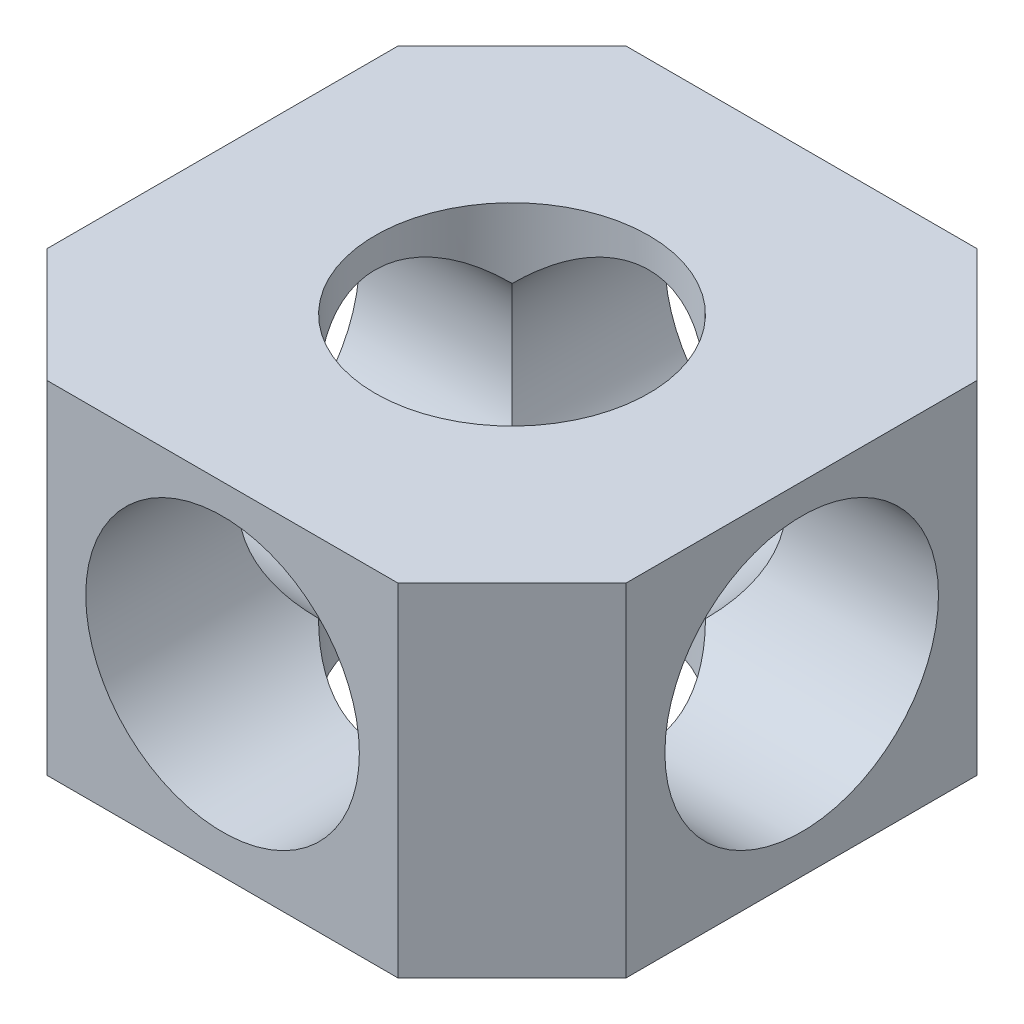
ISO-10303-21;
HEADER;
FILE_DESCRIPTION(('STEP AP214'),'2;1');
FILE_NAME('part.step','',(''),(''),'','','');
FILE_SCHEMA(('AUTOMOTIVE_DESIGN { 1 0 10303 214 1 1 1 1 }'));
ENDSEC;
DATA;
#1=APPLICATION_CONTEXT('core data for automotive mechanical design processes');
#2=APPLICATION_PROTOCOL_DEFINITION('international standard','automotive_design',2000,#1);
#3=PRODUCT_CONTEXT('',#1,'mechanical');
#4=PRODUCT('Part','Part','',(#3));
#5=PRODUCT_RELATED_PRODUCT_CATEGORY('part','',(#4));
#6=PRODUCT_DEFINITION_FORMATION('','',#4);
#7=PRODUCT_DEFINITION_CONTEXT('part definition',#1,'design');
#8=PRODUCT_DEFINITION('design','',#6,#7);
#9=PRODUCT_DEFINITION_SHAPE('','',#8);
#10=(LENGTH_UNIT() NAMED_UNIT(*) SI_UNIT(.MILLI.,.METRE.));
#11=(NAMED_UNIT(*) PLANE_ANGLE_UNIT() SI_UNIT($,.RADIAN.));
#12=(NAMED_UNIT(*) SI_UNIT($,.STERADIAN.) SOLID_ANGLE_UNIT());
#13=UNCERTAINTY_MEASURE_WITH_UNIT(LENGTH_MEASURE(1.E-05),#10,'distance_accuracy_value','');
#14=(GEOMETRIC_REPRESENTATION_CONTEXT(3) GLOBAL_UNCERTAINTY_ASSIGNED_CONTEXT((#13)) GLOBAL_UNIT_ASSIGNED_CONTEXT((#10,
#11,#12)) REPRESENTATION_CONTEXT('',''));
#15=CARTESIAN_POINT('',(0.,0.,0.));
#16=DIRECTION('',(0.,0.,1.));
#17=DIRECTION('',(1.,0.,0.));
#18=AXIS2_PLACEMENT_3D('',#15,#16,#17);
#19=CARTESIAN_POINT('',(-7.13795671357024,2.565,-0.772738095238086));
#20=DIRECTION('',(1.,0.,0.));
#21=DIRECTION('',(0.,0.,-1.));
#22=AXIS2_PLACEMENT_3D('',#19,#20,#21);
#23=CYLINDRICAL_SURFACE('',#22,2.);
#24=CARTESIAN_POINT('',(2.86204328642976,2.565,-0.772738095238086));
#25=DIRECTION('',(1.,0.,0.));
#26=DIRECTION('',(0.,0.,-1.));
#27=AXIS2_PLACEMENT_3D('',#24,#25,#26);
#28=CIRCLE('',#27,2.);
#29=CARTESIAN_POINT('',(2.86204328642976,2.565,-2.77273809523809));
#30=VERTEX_POINT('',#29);
#31=EDGE_CURVE('E187',#30,#30,#28,.T.);
#32=ORIENTED_EDGE('',*,*,#31,.T.);
#33=EDGE_LOOP('',(#32));
#34=FACE_BOUND('',#33,.T.);
#35=CARTESIAN_POINT('',(-1.36962338023691,2.565,-0.772738095238087));
#36=DIRECTION('',(0.707106781186547,0.,0.707106781186547));
#37=DIRECTION('',(0.707106781186547,0.,-0.707106781186547));
#38=AXIS2_PLACEMENT_3D('',#35,#36,#37);
#39=ELLIPSE('',#38,2.82842712474619,2.);
#40=CARTESIAN_POINT('',(0.042922533376434,3.98087924694666,-2.18528400885143));
#41=VERTEX_POINT('',#40);
#42=CARTESIAN_POINT('',(0.0429225333764336,1.14912075305334,-2.18528400885143));
#43=VERTEX_POINT('',#42);
#44=EDGE_CURVE('E140',#41,#43,#39,.F.);
#45=ORIENTED_EDGE('',*,*,#44,.T.);
#46=CARTESIAN_POINT('',(-1.37295671357024,2.565,-0.77273809523809));
#47=DIRECTION('',(0.707106781186547,0.707106781186547,0.));
#48=DIRECTION('',(0.707106781186547,-0.707106781186547,0.));
#49=AXIS2_PLACEMENT_3D('',#46,#47,#48);
#50=ELLIPSE('',#49,2.82842712474619,2.);
#51=CARTESIAN_POINT('',(0.0429225333764287,1.14912075305334,0.639807818375251));
#52=VERTEX_POINT('',#51);
#53=EDGE_CURVE('E60',#43,#52,#50,.F.);
#54=ORIENTED_EDGE('',*,*,#53,.T.);
#55=CARTESIAN_POINT('',(-1.36962338023691,2.565,-0.772738095238087));
#56=DIRECTION('',(0.707106781186547,0.,-0.707106781186547));
#57=DIRECTION('',(0.707106781186547,0.,0.707106781186547));
#58=AXIS2_PLACEMENT_3D('',#55,#56,#57);
#59=ELLIPSE('',#58,2.82842712474619,2.);
#60=CARTESIAN_POINT('',(0.0429225333764285,3.98087924694667,0.639807818375251));
#61=VERTEX_POINT('',#60);
#62=EDGE_CURVE('E154',#52,#61,#59,.F.);
#63=ORIENTED_EDGE('',*,*,#62,.T.);
#64=CARTESIAN_POINT('',(-1.37295671357024,2.565,-0.77273809523809));
#65=DIRECTION('',(0.707106781186547,-0.707106781186547,0.));
#66=DIRECTION('',(0.707106781186547,0.707106781186547,0.));
#67=AXIS2_PLACEMENT_3D('',#64,#65,#66);
#68=ELLIPSE('',#67,2.82842712474619,2.);
#69=EDGE_CURVE('E167',#61,#41,#68,.F.);
#70=ORIENTED_EDGE('',*,*,#69,.T.);
#71=EDGE_LOOP('',(#45,#54,#63,#70));
#72=FACE_BOUND('',#71,.T.);
#73=ADVANCED_FACE('F38',(#34,#72),#23,.F.);
#74=CARTESIAN_POINT('',(2.86204328642976,5.,-5.00440476190476));
#75=DIRECTION('',(-1.,0.,0.));
#76=DIRECTION('',(0.,0.,1.));
#77=AXIS2_PLACEMENT_3D('',#74,#75,#76);
#78=PLANE('',#77);
#79=ORIENTED_EDGE('',*,*,#31,.F.);
#80=EDGE_LOOP('',(#79));
#81=FACE_BOUND('',#80,.T.);
#82=DIRECTION('',(0.,0.,-1.));
#83=VECTOR('',#82,1.);
#84=CARTESIAN_POINT('',(2.86204328642976,0.,-5.00440476190476));
#85=LINE('',#84,#83);
#86=CARTESIAN_POINT('',(2.86204328642976,0.,1.79559523809523));
#87=VERTEX_POINT('',#86);
#88=CARTESIAN_POINT('',(2.86204328642976,0.,-3.33773809523809));
#89=VERTEX_POINT('',#88);
#90=EDGE_CURVE('E213',#87,#89,#85,.T.);
#91=ORIENTED_EDGE('',*,*,#90,.T.);
#92=DIRECTION('',(0.,1.,0.));
#93=VECTOR('',#92,1.);
#94=CARTESIAN_POINT('',(2.86204328642976,5.,-3.33773809523809));
#95=LINE('',#94,#93);
#96=CARTESIAN_POINT('',(2.86204328642976,5.,-3.33773809523809));
#97=VERTEX_POINT('',#96);
#98=EDGE_CURVE('E269',#89,#97,#95,.T.);
#99=ORIENTED_EDGE('',*,*,#98,.T.);
#100=DIRECTION('',(0.,0.,-1.));
#101=VECTOR('',#100,1.);
#102=CARTESIAN_POINT('',(2.86204328642976,5.,-5.00440476190476));
#103=LINE('',#102,#101);
#104=CARTESIAN_POINT('',(2.86204328642976,5.,1.79559523809523));
#105=VERTEX_POINT('',#104);
#106=EDGE_CURVE('E195',#105,#97,#103,.T.);
#107=ORIENTED_EDGE('',*,*,#106,.F.);
#108=DIRECTION('',(0.,-1.,0.));
#109=VECTOR('',#108,1.);
#110=CARTESIAN_POINT('',(2.86204328642976,5.,1.79559523809523));
#111=LINE('',#110,#109);
#112=EDGE_CURVE('E265',#105,#87,#111,.T.);
#113=ORIENTED_EDGE('',*,*,#112,.T.);
#114=EDGE_LOOP('',(#91,#99,#107,#113));
#115=FACE_BOUND('',#114,.T.);
#116=ADVANCED_FACE('F295',(#81,#115),#78,.F.);
#117=CARTESIAN_POINT('',(-5.60462338023691,5.,-5.00440476190476));
#118=DIRECTION('',(0.,0.,1.));
#119=DIRECTION('',(1.,0.,0.));
#120=AXIS2_PLACEMENT_3D('',#117,#118,#119);
#121=PLANE('',#120);
#122=CARTESIAN_POINT('',(-1.36962338023691,2.565,-5.00440476190476));
#123=DIRECTION('',(0.,0.,1.));
#124=DIRECTION('',(1.,0.,0.));
#125=AXIS2_PLACEMENT_3D('',#122,#123,#124);
#126=CIRCLE('',#125,2.);
#127=CARTESIAN_POINT('',(0.63037661976309,2.565,-5.00440476190476));
#128=VERTEX_POINT('',#127);
#129=EDGE_CURVE('E183',#128,#128,#126,.T.);
#130=ORIENTED_EDGE('',*,*,#129,.T.);
#131=EDGE_LOOP('',(#130));
#132=FACE_BOUND('',#131,.T.);
#133=DIRECTION('',(-1.,0.,0.));
#134=VECTOR('',#133,1.);
#135=CARTESIAN_POINT('',(-5.60462338023691,0.,-5.00440476190476));
#136=LINE('',#135,#134);
#137=CARTESIAN_POINT('',(1.19537661976309,0.,-5.00440476190476));
#138=VERTEX_POINT('',#137);
#139=CARTESIAN_POINT('',(-3.93795671357023,0.,-5.00440476190476));
#140=VERTEX_POINT('',#139);
#141=EDGE_CURVE('E217',#138,#140,#136,.T.);
#142=ORIENTED_EDGE('',*,*,#141,.T.);
#143=DIRECTION('',(0.,1.,0.));
#144=VECTOR('',#143,1.);
#145=CARTESIAN_POINT('',(-3.93795671357023,5.,-5.00440476190476));
#146=LINE('',#145,#144);
#147=CARTESIAN_POINT('',(-3.93795671357023,5.,-5.00440476190476));
#148=VERTEX_POINT('',#147);
#149=EDGE_CURVE('E250',#140,#148,#146,.T.);
#150=ORIENTED_EDGE('',*,*,#149,.T.);
#151=DIRECTION('',(-1.,0.,0.));
#152=VECTOR('',#151,1.);
#153=CARTESIAN_POINT('',(-5.60462338023691,5.,-5.00440476190476));
#154=LINE('',#153,#152);
#155=CARTESIAN_POINT('',(1.19537661976309,5.,-5.00440476190476));
#156=VERTEX_POINT('',#155);
#157=EDGE_CURVE('E199',#156,#148,#154,.T.);
#158=ORIENTED_EDGE('',*,*,#157,.F.);
#159=DIRECTION('',(0.,-1.,0.));
#160=VECTOR('',#159,1.);
#161=CARTESIAN_POINT('',(1.19537661976309,5.,-5.00440476190476));
#162=LINE('',#161,#160);
#163=EDGE_CURVE('E246',#156,#138,#162,.T.);
#164=ORIENTED_EDGE('',*,*,#163,.T.);
#165=EDGE_LOOP('',(#142,#150,#158,#164));
#166=FACE_BOUND('',#165,.T.);
#167=ADVANCED_FACE('F300',(#132,#166),#121,.F.);
#168=CARTESIAN_POINT('',(-5.60462338023691,5.,-5.00440476190476));
#169=DIRECTION('',(1.,0.,0.));
#170=DIRECTION('',(0.,0.,-1.));
#171=AXIS2_PLACEMENT_3D('',#168,#169,#170);
#172=PLANE('',#171);
#173=CARTESIAN_POINT('',(-5.60462338023691,2.565,-0.772738095238086));
#174=DIRECTION('',(1.,0.,0.));
#175=DIRECTION('',(0.,0.,-1.));
#176=AXIS2_PLACEMENT_3D('',#173,#174,#175);
#177=CIRCLE('',#176,2.);
#178=CARTESIAN_POINT('',(-5.60462338023691,2.565,-2.77273809523809));
#179=VERTEX_POINT('',#178);
#180=EDGE_CURVE('E194',#179,#179,#177,.T.);
#181=ORIENTED_EDGE('',*,*,#180,.T.);
#182=EDGE_LOOP('',(#181));
#183=FACE_BOUND('',#182,.T.);
#184=DIRECTION('',(0.,0.,1.));
#185=VECTOR('',#184,1.);
#186=CARTESIAN_POINT('',(-5.60462338023691,5.,-5.00440476190476));
#187=LINE('',#186,#185);
#188=CARTESIAN_POINT('',(-5.60462338023691,5.,-3.33773809523809));
#189=VERTEX_POINT('',#188);
#190=CARTESIAN_POINT('',(-5.60462338023691,5.,1.79559523809523));
#191=VERTEX_POINT('',#190);
#192=EDGE_CURVE('E204',#189,#191,#187,.T.);
#193=ORIENTED_EDGE('',*,*,#192,.F.);
#194=DIRECTION('',(0.,-1.,0.));
#195=VECTOR('',#194,1.);
#196=CARTESIAN_POINT('',(-5.60462338023691,5.,-3.33773809523809));
#197=LINE('',#196,#195);
#198=CARTESIAN_POINT('',(-5.60462338023691,0.,-3.33773809523809));
#199=VERTEX_POINT('',#198);
#200=EDGE_CURVE('E230',#189,#199,#197,.T.);
#201=ORIENTED_EDGE('',*,*,#200,.T.);
#202=DIRECTION('',(0.,0.,1.));
#203=VECTOR('',#202,1.);
#204=CARTESIAN_POINT('',(-5.60462338023691,0.,-5.00440476190476));
#205=LINE('',#204,#203);
#206=CARTESIAN_POINT('',(-5.60462338023691,0.,1.79559523809523));
#207=VERTEX_POINT('',#206);
#208=EDGE_CURVE('E221',#199,#207,#205,.T.);
#209=ORIENTED_EDGE('',*,*,#208,.T.);
#210=DIRECTION('',(0.,1.,0.));
#211=VECTOR('',#210,1.);
#212=CARTESIAN_POINT('',(-5.60462338023691,5.,1.79559523809523));
#213=LINE('',#212,#211);
#214=EDGE_CURVE('E212',#207,#191,#213,.T.);
#215=ORIENTED_EDGE('',*,*,#214,.T.);
#216=EDGE_LOOP('',(#193,#201,#209,#215));
#217=FACE_BOUND('',#216,.T.);
#218=ADVANCED_FACE('F281',(#183,#217),#172,.F.);
#219=CARTESIAN_POINT('',(-5.60462338023691,5.,3.46226190476191));
#220=DIRECTION('',(0.,0.,-1.));
#221=DIRECTION('',(-1.,0.,0.));
#222=AXIS2_PLACEMENT_3D('',#219,#220,#221);
#223=PLANE('',#222);
#224=CARTESIAN_POINT('',(-1.36962338023691,2.565,3.46226190476191));
#225=DIRECTION('',(0.,0.,1.));
#226=DIRECTION('',(1.,0.,0.));
#227=AXIS2_PLACEMENT_3D('',#224,#225,#226);
#228=CIRCLE('',#227,2.);
#229=CARTESIAN_POINT('',(0.63037661976309,2.565,3.46226190476191));
#230=VERTEX_POINT('',#229);
#231=EDGE_CURVE('E182',#230,#230,#228,.T.);
#232=ORIENTED_EDGE('',*,*,#231,.F.);
#233=EDGE_LOOP('',(#232));
#234=FACE_BOUND('',#233,.T.);
#235=DIRECTION('',(1.,0.,0.));
#236=VECTOR('',#235,1.);
#237=CARTESIAN_POINT('',(-5.60462338023691,5.,3.46226190476191));
#238=LINE('',#237,#236);
#239=CARTESIAN_POINT('',(-3.93795671357023,5.,3.46226190476191));
#240=VERTEX_POINT('',#239);
#241=CARTESIAN_POINT('',(1.19537661976309,5.,3.46226190476191));
#242=VERTEX_POINT('',#241);
#243=EDGE_CURVE('E208',#240,#242,#238,.T.);
#244=ORIENTED_EDGE('',*,*,#243,.F.);
#245=DIRECTION('',(0.,-1.,0.));
#246=VECTOR('',#245,1.);
#247=CARTESIAN_POINT('',(-3.93795671357023,5.,3.46226190476191));
#248=LINE('',#247,#246);
#249=CARTESIAN_POINT('',(-3.93795671357023,0.,3.46226190476191));
#250=VERTEX_POINT('',#249);
#251=EDGE_CURVE('E160',#240,#250,#248,.T.);
#252=ORIENTED_EDGE('',*,*,#251,.T.);
#253=DIRECTION('',(1.,0.,0.));
#254=VECTOR('',#253,1.);
#255=CARTESIAN_POINT('',(-5.60462338023691,0.,3.46226190476191));
#256=LINE('',#255,#254);
#257=CARTESIAN_POINT('',(1.19537661976309,0.,3.46226190476191));
#258=VERTEX_POINT('',#257);
#259=EDGE_CURVE('E200',#250,#258,#256,.T.);
#260=ORIENTED_EDGE('',*,*,#259,.T.);
#261=DIRECTION('',(0.,1.,0.));
#262=VECTOR('',#261,1.);
#263=CARTESIAN_POINT('',(1.19537661976309,5.,3.46226190476191));
#264=LINE('',#263,#262);
#265=EDGE_CURVE('E272',#258,#242,#264,.T.);
#266=ORIENTED_EDGE('',*,*,#265,.T.);
#267=EDGE_LOOP('',(#244,#252,#260,#266));
#268=FACE_BOUND('',#267,.T.);
#269=ADVANCED_FACE('F333',(#234,#268),#223,.F.);
#270=CARTESIAN_POINT('',(0.,5.,0.));
#271=DIRECTION('',(0.,1.,0.));
#272=DIRECTION('',(0.,0.,1.));
#273=AXIS2_PLACEMENT_3D('',#270,#271,#272);
#274=PLANE('',#273);
#275=CARTESIAN_POINT('',(-1.37295671357024,5.,-0.772738095238095));
#276=DIRECTION('',(0.,1.,0.));
#277=DIRECTION('',(0.,0.,1.));
#278=AXIS2_PLACEMENT_3D('',#275,#276,#277);
#279=CIRCLE('',#278,2.);
#280=CARTESIAN_POINT('',(-1.37295671357024,5.,1.22726190476191));
#281=VERTEX_POINT('',#280);
#282=EDGE_CURVE('E150',#281,#281,#279,.T.);
#283=ORIENTED_EDGE('',*,*,#282,.F.);
#284=EDGE_LOOP('',(#283));
#285=FACE_BOUND('',#284,.T.);
#286=ORIENTED_EDGE('',*,*,#157,.T.);
#287=DIRECTION('',(0.707106781186548,0.,-0.707106781186548));
#288=VECTOR('',#287,1.);
#289=CARTESIAN_POINT('',(-4.4711807377375,5.,-4.4711807377375));
#290=LINE('',#289,#288);
#291=EDGE_CURVE('E262',#148,#189,#290,.F.);
#292=ORIENTED_EDGE('',*,*,#291,.T.);
#293=ORIENTED_EDGE('',*,*,#192,.T.);
#294=DIRECTION('',(-0.707106781186548,0.,-0.707106781186547));
#295=VECTOR('',#294,1.);
#296=CARTESIAN_POINT('',(-3.70010930916607,5.,3.70010930916607));
#297=LINE('',#296,#295);
#298=EDGE_CURVE('E256',#191,#240,#297,.F.);
#299=ORIENTED_EDGE('',*,*,#298,.T.);
#300=ORIENTED_EDGE('',*,*,#243,.T.);
#301=DIRECTION('',(-0.707106781186548,0.,0.707106781186547));
#302=VECTOR('',#301,1.);
#303=CARTESIAN_POINT('',(2.3288192622625,5.,2.3288192622625));
#304=LINE('',#303,#302);
#305=EDGE_CURVE('E253',#242,#105,#304,.F.);
#306=ORIENTED_EDGE('',*,*,#305,.T.);
#307=ORIENTED_EDGE('',*,*,#106,.T.);
#308=DIRECTION('',(0.707106781186548,0.,0.707106781186548));
#309=VECTOR('',#308,1.);
#310=CARTESIAN_POINT('',(3.09989069083393,5.,-3.09989069083393));
#311=LINE('',#310,#309);
#312=EDGE_CURVE('E259',#97,#156,#311,.F.);
#313=ORIENTED_EDGE('',*,*,#312,.T.);
#314=EDGE_LOOP('',(#286,#292,#293,#299,#300,#306,#307,#313));
#315=FACE_BOUND('',#314,.T.);
#316=ADVANCED_FACE('F316',(#285,#315),#274,.T.);
#317=CARTESIAN_POINT('',(0.,0.,0.));
#318=DIRECTION('',(0.,1.,0.));
#319=DIRECTION('',(0.,0.,1.));
#320=AXIS2_PLACEMENT_3D('',#317,#318,#319);
#321=PLANE('',#320);
#322=CARTESIAN_POINT('',(-1.37295671357024,0.,-0.772738095238095));
#323=DIRECTION('',(0.,1.,0.));
#324=DIRECTION('',(0.,0.,1.));
#325=AXIS2_PLACEMENT_3D('',#322,#323,#324);
#326=CIRCLE('',#325,2.);
#327=CARTESIAN_POINT('',(-1.37295671357024,0.,1.22726190476191));
#328=VERTEX_POINT('',#327);
#329=EDGE_CURVE('E174',#328,#328,#326,.T.);
#330=ORIENTED_EDGE('',*,*,#329,.T.);
#331=EDGE_LOOP('',(#330));
#332=FACE_BOUND('',#331,.T.);
#333=ORIENTED_EDGE('',*,*,#208,.F.);
#334=DIRECTION('',(-0.707106781186548,0.,0.707106781186548));
#335=VECTOR('',#334,1.);
#336=CARTESIAN_POINT('',(-5.60462338023691,0.,-3.33773809523809));
#337=LINE('',#336,#335);
#338=EDGE_CURVE('E243',#199,#140,#337,.F.);
#339=ORIENTED_EDGE('',*,*,#338,.T.);
#340=ORIENTED_EDGE('',*,*,#141,.F.);
#341=DIRECTION('',(-0.707106781186548,0.,-0.707106781186548));
#342=VECTOR('',#341,1.);
#343=CARTESIAN_POINT('',(1.19537661976309,0.,-5.00440476190476));
#344=LINE('',#343,#342);
#345=EDGE_CURVE('E240',#138,#89,#344,.F.);
#346=ORIENTED_EDGE('',*,*,#345,.T.);
#347=ORIENTED_EDGE('',*,*,#90,.F.);
#348=DIRECTION('',(0.707106781186548,0.,-0.707106781186547));
#349=VECTOR('',#348,1.);
#350=CARTESIAN_POINT('',(2.86204328642976,0.,1.79559523809523));
#351=LINE('',#350,#349);
#352=EDGE_CURVE('E234',#87,#258,#351,.F.);
#353=ORIENTED_EDGE('',*,*,#352,.T.);
#354=ORIENTED_EDGE('',*,*,#259,.F.);
#355=DIRECTION('',(0.707106781186548,0.,0.707106781186547));
#356=VECTOR('',#355,1.);
#357=CARTESIAN_POINT('',(-3.93795671357023,0.,3.46226190476191));
#358=LINE('',#357,#356);
#359=EDGE_CURVE('E237',#250,#207,#358,.F.);
#360=ORIENTED_EDGE('',*,*,#359,.T.);
#361=EDGE_LOOP('',(#333,#339,#340,#346,#347,#353,#354,#360));
#362=FACE_BOUND('',#361,.T.);
#363=ADVANCED_FACE('F336',(#332,#362),#321,.F.);
#364=CARTESIAN_POINT('',(-5.60462338023691,5.,-3.33773809523809));
#365=DIRECTION('',(0.707106781186547,0.,0.707106781186547));
#366=DIRECTION('',(0.,-1.,0.));
#367=AXIS2_PLACEMENT_3D('',#364,#365,#366);
#368=PLANE('',#367);
#369=ORIENTED_EDGE('',*,*,#291,.F.);
#370=ORIENTED_EDGE('',*,*,#149,.F.);
#371=ORIENTED_EDGE('',*,*,#338,.F.);
#372=ORIENTED_EDGE('',*,*,#200,.F.);
#373=EDGE_LOOP('',(#369,#370,#371,#372));
#374=FACE_BOUND('',#373,.T.);
#375=ADVANCED_FACE('F322',(#374),#368,.F.);
#376=CARTESIAN_POINT('',(1.19537661976309,5.,-5.00440476190476));
#377=DIRECTION('',(-0.707106781186547,0.,0.707106781186547));
#378=DIRECTION('',(0.,-1.,0.));
#379=AXIS2_PLACEMENT_3D('',#376,#377,#378);
#380=PLANE('',#379);
#381=ORIENTED_EDGE('',*,*,#312,.F.);
#382=ORIENTED_EDGE('',*,*,#98,.F.);
#383=ORIENTED_EDGE('',*,*,#345,.F.);
#384=ORIENTED_EDGE('',*,*,#163,.F.);
#385=EDGE_LOOP('',(#381,#382,#383,#384));
#386=FACE_BOUND('',#385,.T.);
#387=ADVANCED_FACE('F312',(#386),#380,.F.);
#388=CARTESIAN_POINT('',(-3.93795671357023,5.,3.46226190476191));
#389=DIRECTION('',(0.707106781186547,0.,-0.707106781186548));
#390=DIRECTION('',(0.,-1.,0.));
#391=AXIS2_PLACEMENT_3D('',#388,#389,#390);
#392=PLANE('',#391);
#393=ORIENTED_EDGE('',*,*,#298,.F.);
#394=ORIENTED_EDGE('',*,*,#214,.F.);
#395=ORIENTED_EDGE('',*,*,#359,.F.);
#396=ORIENTED_EDGE('',*,*,#251,.F.);
#397=EDGE_LOOP('',(#393,#394,#395,#396));
#398=FACE_BOUND('',#397,.T.);
#399=ADVANCED_FACE('F291',(#398),#392,.F.);
#400=CARTESIAN_POINT('',(2.86204328642976,5.,1.79559523809523));
#401=DIRECTION('',(-0.707106781186547,0.,-0.707106781186548));
#402=DIRECTION('',(0.,-1.,0.));
#403=AXIS2_PLACEMENT_3D('',#400,#401,#402);
#404=PLANE('',#403);
#405=ORIENTED_EDGE('',*,*,#305,.F.);
#406=ORIENTED_EDGE('',*,*,#265,.F.);
#407=ORIENTED_EDGE('',*,*,#352,.F.);
#408=ORIENTED_EDGE('',*,*,#112,.F.);
#409=EDGE_LOOP('',(#405,#406,#407,#408));
#410=FACE_BOUND('',#409,.T.);
#411=ADVANCED_FACE('F40',(#410),#404,.F.);
#412=CARTESIAN_POINT('',(-1.36962338023691,2.565,-0.772738095238087));
#413=DIRECTION('',(0.707106781186547,0.,-0.707106781186547));
#414=DIRECTION('',(0.707106781186547,0.,0.707106781186547));
#415=AXIS2_PLACEMENT_3D('',#412,#413,#414);
#416=ELLIPSE('',#415,2.82842712474619,2.);
#417=CARTESIAN_POINT('',(-2.78550262718358,1.15245408638666,-2.18861734218476));
#418=VERTEX_POINT('',#417);
#419=CARTESIAN_POINT('',(-2.78550262718421,3.97754591361271,-2.18861734218413));
#420=VERTEX_POINT('',#419);
#421=EDGE_CURVE('E146',#418,#420,#416,.T.);
#422=ORIENTED_EDGE('',*,*,#421,.T.);
#423=CARTESIAN_POINT('',(-1.37295671357024,2.565,-0.77273809523809));
#424=DIRECTION('',(0.707106781186547,0.707106781186547,0.));
#425=DIRECTION('',(0.707106781186547,-0.707106781186547,0.));
#426=AXIS2_PLACEMENT_3D('',#423,#424,#425);
#427=ELLIPSE('',#426,2.82842712474619,2.);
#428=CARTESIAN_POINT('',(-2.78550262718357,3.97754591361334,0.643141151708578));
#429=VERTEX_POINT('',#428);
#430=EDGE_CURVE('E68',#420,#429,#427,.T.);
#431=ORIENTED_EDGE('',*,*,#430,.T.);
#432=CARTESIAN_POINT('',(-1.36962338023691,2.565,-0.772738095238087));
#433=DIRECTION('',(0.707106781186547,0.,0.707106781186547));
#434=DIRECTION('',(0.707106781186547,0.,-0.707106781186547));
#435=AXIS2_PLACEMENT_3D('',#432,#433,#434);
#436=ELLIPSE('',#435,2.82842712474619,2.);
#437=CARTESIAN_POINT('',(-2.78550262718357,1.15245408638666,0.643141151708578));
#438=VERTEX_POINT('',#437);
#439=EDGE_CURVE('E148',#429,#438,#436,.T.);
#440=ORIENTED_EDGE('',*,*,#439,.T.);
#441=CARTESIAN_POINT('',(-1.37295671357024,2.565,-0.77273809523809));
#442=DIRECTION('',(0.707106781186547,-0.707106781186547,0.));
#443=DIRECTION('',(0.707106781186547,0.707106781186547,0.));
#444=AXIS2_PLACEMENT_3D('',#441,#442,#443);
#445=ELLIPSE('',#444,2.82842712474619,2.);
#446=EDGE_CURVE('E133',#438,#418,#445,.T.);
#447=ORIENTED_EDGE('',*,*,#446,.T.);
#448=EDGE_LOOP('',(#422,#431,#440,#447));
#449=FACE_BOUND('',#448,.T.);
#450=ORIENTED_EDGE('',*,*,#180,.F.);
#451=EDGE_LOOP('',(#450));
#452=FACE_BOUND('',#451,.T.);
#453=ADVANCED_FACE('F144',(#449,#452),#23,.F.);
#454=CARTESIAN_POINT('',(-1.36962338023691,2.565,-5.00440476190476));
#455=DIRECTION('',(0.,0.,1.));
#456=DIRECTION('',(1.,0.,0.));
#457=AXIS2_PLACEMENT_3D('',#454,#455,#456);
#458=CYLINDRICAL_SURFACE('',#457,2.);
#459=ORIENTED_EDGE('',*,*,#231,.T.);
#460=EDGE_LOOP('',(#459));
#461=FACE_BOUND('',#460,.T.);
#462=ORIENTED_EDGE('',*,*,#62,.F.);
#463=CARTESIAN_POINT('',(0.626881862890375,2.44681872328806,-0.798148095238087));
#464=CARTESIAN_POINT('',(0.626968653362742,2.44830541408999,-0.791440518514822));
#465=CARTESIAN_POINT('',(0.627020292608223,2.44918637747427,-0.784602736861689));
#466=CARTESIAN_POINT('',(0.627053413122404,2.44974740377253,-0.77102386609462));
#467=CARTESIAN_POINT('',(0.627036369345142,2.44945271495492,-0.764283831190761));
#468=CARTESIAN_POINT('',(0.626923768663214,2.44752706266502,-0.749343416407655));
#469=CARTESIAN_POINT('',(0.626810242557096,2.44559053649149,-0.741183516293453));
#470=CARTESIAN_POINT('',(0.626495100463348,2.44042644219319,-0.725240640504321));
#471=CARTESIAN_POINT('',(0.626292763128238,2.43718832070925,-0.717461343687408));
#472=CARTESIAN_POINT('',(0.625123247597044,2.41950348084459,-0.680129825460022));
#473=CARTESIAN_POINT('',(0.623646772505424,2.39991554292744,-0.653263585807526));
#474=CARTESIAN_POINT('',(0.619833721003115,2.35875595136378,-0.601118843108455));
#475=CARTESIAN_POINT('',(0.617485708689943,2.33716092162134,-0.575866935304079));
#476=CARTESIAN_POINT('',(0.609260395116785,2.27195918748618,-0.502089679712881));
#477=CARTESIAN_POINT('',(0.602162956107738,2.22720333762038,-0.454597737345736));
#478=CARTESIAN_POINT('',(0.584678047942636,2.13739808137218,-0.360506959291873));
#479=CARTESIAN_POINT('',(0.574285932078709,2.09234834893669,-0.313909484177191));
#480=CARTESIAN_POINT('',(0.550236282793467,2.00262047217223,-0.221750894615744));
#481=CARTESIAN_POINT('',(0.536599607010762,1.95794176759633,-0.176185117409808));
#482=CARTESIAN_POINT('',(0.505971131468274,1.8690400432501,-0.0857850431793336));
#483=CARTESIAN_POINT('',(0.488980456726956,1.82481687589998,-0.0409505063222391));
#484=CARTESIAN_POINT('',(0.444518103380864,1.72048657701456,0.064632505716627));
#485=CARTESIAN_POINT('',(0.415508012205277,1.66066197620008,0.125023218052942));
#486=CARTESIAN_POINT('',(0.350707388476886,1.54275165121347,0.243906793450569));
#487=CARTESIAN_POINT('',(0.314913758193276,1.48466673556406,0.302398775099359));
#488=CARTESIAN_POINT('',(0.23623277974413,1.37084168563436,0.416941933695175));
#489=CARTESIAN_POINT('',(0.193342241861378,1.31510261989472,0.472991998743216));
#490=CARTESIAN_POINT('',(0.100196154863606,1.20679190057535,0.581864984349376));
#491=CARTESIAN_POINT('',(0.0499457731964238,1.15421806089581,0.634690132595057));
#492=CARTESIAN_POINT('',(-0.0710083275901612,1.04119861409784,0.748228070497927));
#493=CARTESIAN_POINT('',(-0.143742303991987,0.981812885153516,0.807870795281438));
#494=CARTESIAN_POINT('',(-0.301169246922365,0.871599554827783,0.918562313546522));
#495=CARTESIAN_POINT('',(-0.385839632886213,0.820756182693591,0.969626943729512));
#496=CARTESIAN_POINT('',(-0.550565945140237,0.738517105954875,1.05224988152962));
#497=CARTESIAN_POINT('',(-0.628754592736842,0.705270326569588,1.08566268948299));
#498=CARTESIAN_POINT('',(-0.791881363973619,0.648320590168981,1.14293579372247));
#499=CARTESIAN_POINT('',(-0.876816056526008,0.62461281829423,1.16680090921709));
#500=CARTESIAN_POINT('',(-1.05207611382748,0.588331438275348,1.20339353573363));
#501=CARTESIAN_POINT('',(-1.14243568994218,0.5758386792434,1.21604016498446));
#502=CARTESIAN_POINT('',(-1.32488238946252,0.563415173775102,1.22876993117819));
#503=CARTESIAN_POINT('',(-1.41696853233304,0.563477501061488,1.22885999516784));
#504=CARTESIAN_POINT('',(-1.58853615652218,0.575379926974587,1.21724553870305));
#505=CARTESIAN_POINT('',(-1.66821848640054,0.585823859114432,1.20693703778497));
#506=CARTESIAN_POINT('',(-1.82412213557752,0.61570956515794,1.17732549634196));
#507=CARTESIAN_POINT('',(-1.90034296374677,0.63515261153314,1.15802118380984));
#508=CARTESIAN_POINT('',(-2.05045326374829,0.682740855656601,1.11072151752957));
#509=CARTESIAN_POINT('',(-2.12415692655465,0.711177011715712,1.08243542605811));
#510=CARTESIAN_POINT('',(-2.26520177695958,0.775043276698852,1.01887979989617));
#511=CARTESIAN_POINT('',(-2.33253978273107,0.810476856186051,0.983606799831108));
#512=CARTESIAN_POINT('',(-2.49477332366562,0.907548112976819,0.886962365344513));
#513=CARTESIAN_POINT('',(-2.58507918059803,0.973047411993666,0.821739789282728));
#514=CARTESIAN_POINT('',(-2.74977896307848,1.11346744537549,0.681942187902372));
#515=CARTESIAN_POINT('',(-2.82412948723546,1.18841301893002,0.607342506737352));
#516=CARTESIAN_POINT('',(-2.98327763907599,1.37488727113691,0.421826227722714));
#517=CARTESIAN_POINT('',(-3.06114452974772,1.48942212331261,0.307954668477355));
#518=CARTESIAN_POINT('',(-3.15779083605925,1.66667504082443,0.132162011788626));
#519=CARTESIAN_POINT('',(-3.18665827530086,1.72670460298748,0.0726972249102577));
#520=CARTESIAN_POINT('',(-3.23795269185025,1.84827428218959,-0.0474460619761497));
#521=CARTESIAN_POINT('',(-3.2603828445219,1.9098136381643,-0.108123947735549));
#522=CARTESIAN_POINT('',(-3.29055261093904,2.00699195344186,-0.203420353948559));
#523=CARTESIAN_POINT('',(-3.30042759741408,2.04219200708286,-0.237834124428421));
#524=CARTESIAN_POINT('',(-3.31819614517618,2.11290582213491,-0.306585205929045));
#525=CARTESIAN_POINT('',(-3.3260969054125,2.14841794007647,-0.340922328457709));
#526=CARTESIAN_POINT('',(-3.33796804339093,2.20962747934893,-0.399449971575225));
#527=CARTESIAN_POINT('',(-3.34241362984602,2.23518214662807,-0.423693037643091));
#528=CARTESIAN_POINT('',(-3.35037698731308,2.28696013359796,-0.472044337797173));
#529=CARTESIAN_POINT('',(-3.35388663279548,2.31318727116772,-0.496149718855315));
#530=CARTESIAN_POINT('',(-3.35996725505096,2.36681437757372,-0.543907549757438));
#531=CARTESIAN_POINT('',(-3.36252603309636,2.39422486680139,-0.567550656732657));
#532=CARTESIAN_POINT('',(-3.36556905401993,2.4369390788673,-0.600633583995584));
#533=CARTESIAN_POINT('',(-3.36644765240694,2.45134408421722,-0.611202631317875));
#534=CARTESIAN_POINT('',(-3.36792522921165,2.4812546197662,-0.630643436414234));
#535=CARTESIAN_POINT('',(-3.36852641482837,2.49675029099312,-0.639528248350514));
#536=CARTESIAN_POINT('',(-3.36904681117823,2.51684304992723,-0.647730161197761));
#537=CARTESIAN_POINT('',(-3.3691330701144,2.52055874013168,-0.649119151756908));
#538=CARTESIAN_POINT('',(-3.36928621674727,2.52808338158935,-0.651618482578476));
#539=CARTESIAN_POINT('',(-3.36935309858552,2.53189236067069,-0.652728738555165));
#540=CARTESIAN_POINT('',(-3.36952120213725,2.54339445536589,-0.655545913854623));
#541=CARTESIAN_POINT('',(-3.36959142820791,2.55122047933881,-0.656764491543715));
#542=CARTESIAN_POINT('',(-3.36963808830181,2.56703412117554,-0.657569724659448));
#543=CARTESIAN_POINT('',(-3.3696136443125,2.57502256493443,-0.657141103509838));
#544=CARTESIAN_POINT('',(-3.36947279594924,2.59079002306829,-0.654734389312422));
#545=CARTESIAN_POINT('',(-3.36935585728682,2.59856754828327,-0.652747294423519));
#546=CARTESIAN_POINT('',(-3.36890433255042,2.62053489199382,-0.645401296798543));
#547=CARTESIAN_POINT('',(-3.36846860219081,2.63421435470519,-0.638616827932304));
#548=CARTESIAN_POINT('',(-3.36738234429129,2.66057334982889,-0.623312839571355));
#549=CARTESIAN_POINT('',(-3.36673010156592,2.67324386226047,-0.614779680657488));
#550=CARTESIAN_POINT('',(-3.36435088781211,2.71264470553841,-0.586393932707137));
#551=CARTESIAN_POINT('',(-3.36226494304623,2.73828836412643,-0.56508538555722));
#552=CARTESIAN_POINT('',(-3.35723772810126,2.78865350087861,-0.521491490127395));
#553=CARTESIAN_POINT('',(-3.35429460097677,2.81337284407203,-0.499204111338538));
#554=CARTESIAN_POINT('',(-3.34756132778534,2.86227225804443,-0.454225684573758));
#555=CARTESIAN_POINT('',(-3.34377244661055,2.88645307544628,-0.431535285513047));
#556=CARTESIAN_POINT('',(-3.33534843634046,2.93448245150747,-0.386012951143216));
#557=CARTESIAN_POINT('',(-3.33071405852723,2.95833128506809,-0.363181158734391));
#558=CARTESIAN_POINT('',(-3.31026956436595,3.05422904798539,-0.270870217511364));
#559=CARTESIAN_POINT('',(-3.29094110860271,3.12539661989488,-0.20120959850958));
#560=CARTESIAN_POINT('',(-3.24416771157794,3.26612278222722,-0.0628617716077494));
#561=CARTESIAN_POINT('',(-3.21671476587596,3.33567971259253,0.00582440598289065));
#562=CARTESIAN_POINT('',(-3.15338225871841,3.47269043707845,0.141417115504021));
#563=CARTESIAN_POINT('',(-3.11750316015113,3.54014434649743,0.20832374496879));
#564=CARTESIAN_POINT('',(-3.03695882454836,3.6722353003789,0.339474232182596));
#565=CARTESIAN_POINT('',(-2.99230065007384,3.73687455843655,0.403720180417285));
#566=CARTESIAN_POINT('',(-2.88232693531344,3.87701942066558,0.543089162432976));
#567=CARTESIAN_POINT('',(-2.81462255718493,3.95159055964158,0.617301152371085));
#568=CARTESIAN_POINT('',(-2.6644169579222,4.09277656536249,0.757842773050416));
#569=CARTESIAN_POINT('',(-2.58194050917023,4.1594044458629,0.824185295729539));
#570=CARTESIAN_POINT('',(-2.4192164713434,4.26971723857643,0.934020857825005));
#571=CARTESIAN_POINT('',(-2.34161349825245,4.31534807562363,0.979452410235969));
#572=CARTESIAN_POINT('',(-2.1769515833107,4.39711286323794,1.06083577839476));
#573=CARTESIAN_POINT('',(-2.08990373052303,4.43325778410943,1.09679854479411));
#574=CARTESIAN_POINT('',(-1.92303541438175,4.48857051514917,1.15178637088161));
#575=CARTESIAN_POINT('',(-1.84442644435622,4.50956337942319,1.17263497529525));
#576=CARTESIAN_POINT('',(-1.68335043436358,4.54194401842704,1.20473086030319));
#577=CARTESIAN_POINT('',(-1.6008858721595,4.55333787470683,1.21598422011784));
#578=CARTESIAN_POINT('',(-1.43414886431375,4.56571082424417,1.22807702095647));
#579=CARTESIAN_POINT('',(-1.34987166478172,4.56665799044124,1.22888453881095));
#580=CARTESIAN_POINT('',(-1.18243388855064,4.55798534003781,1.21993165825688));
#581=CARTESIAN_POINT('',(-1.09927346287125,4.54836410856765,1.2101698448562));
#582=CARTESIAN_POINT('',(-0.940192695769524,4.5199502549164,1.1814779380362));
#583=CARTESIAN_POINT('',(-0.864114916353659,4.50158835573054,1.16297871091231));
#584=CARTESIAN_POINT('',(-0.7167680538065,4.45701365236741,1.11812373251206));
#585=CARTESIAN_POINT('',(-0.64550064788551,4.43079812705243,1.09176525816532));
#586=CARTESIAN_POINT('',(-0.482006169709601,4.36023107758311,1.02084573985218));
#587=CARTESIAN_POINT('',(-0.392448365222703,4.31279414693096,0.973195074217151));
#588=CARTESIAN_POINT('',(-0.225368357532913,4.20830225245539,0.868245417478821));
#589=CARTESIAN_POINT('',(-0.147874395962298,4.15122535316799,0.810924422167463));
#590=CARTESIAN_POINT('',(0.0218810770983017,4.00732872558224,0.666388980617745));
#591=CARTESIAN_POINT('',(0.108790654787289,3.91737951882707,0.576022892857643));
#592=CARTESIAN_POINT('',(0.261167010440025,3.72913550568919,0.386756758330504));
#593=CARTESIAN_POINT('',(0.326627001224689,3.63083807008577,0.287854022840295));
#594=CARTESIAN_POINT('',(0.439444803314886,3.42601254096415,0.0813425125319285));
#595=CARTESIAN_POINT('',(0.486189392335689,3.31932483217385,-0.0264398178111137));
#596=CARTESIAN_POINT('',(0.54813013582397,3.13790829087193,-0.210910663368177));
#597=CARTESIAN_POINT('',(0.568633968844181,3.06385186738832,-0.286538964755835));
#598=CARTESIAN_POINT('',(0.589853215471537,2.96630429099812,-0.38801703598267));
#599=CARTESIAN_POINT('',(0.594558347685536,2.94258205099943,-0.41284135412694));
#600=CARTESIAN_POINT('',(0.603044335834824,2.89538437826857,-0.462798527960089));
#601=CARTESIAN_POINT('',(0.606826871432216,2.8719085726186,-0.48793073413215));
#602=CARTESIAN_POINT('',(0.612237292510368,2.83415593924011,-0.529298601665759));
#603=CARTESIAN_POINT('',(0.614142358723478,2.81971708791389,-0.545352465560621));
#604=CARTESIAN_POINT('',(0.617601479784674,2.79115051796682,-0.577935751408026));
#605=CARTESIAN_POINT('',(0.619153695221499,2.77702476130918,-0.594467180895263));
#606=CARTESIAN_POINT('',(0.621899347889571,2.74947682879293,-0.628366125703882));
#607=CARTESIAN_POINT('',(0.623089162490636,2.73606279779601,-0.645740190887786));
#608=CARTESIAN_POINT('',(0.625060411186113,2.71122361998489,-0.681881199373292));
#609=CARTESIAN_POINT('',(0.625845837583002,2.69977980283469,-0.700632352020794));
#610=CARTESIAN_POINT('',(0.626546369695,2.68875727417455,-0.72764882176312));
#611=CARTESIAN_POINT('',(0.626693745053902,2.68633271959651,-0.734665908374295));
#612=CARTESIAN_POINT('',(0.6269149598901,2.68263429622298,-0.748982168052058));
#613=CARTESIAN_POINT('',(0.626989139095723,2.68135511395136,-0.756279873004542));
#614=CARTESIAN_POINT('',(0.627048618073096,2.68033144096721,-0.769365943709161));
#615=CARTESIAN_POINT('',(0.627049883902419,2.68031118118687,-0.775133068738004));
#616=CARTESIAN_POINT('',(0.627003325855824,2.68110906870096,-0.786681073681847));
#617=CARTESIAN_POINT('',(0.626954894030295,2.68193759900795,-0.792461239921565));
#618=CARTESIAN_POINT('',(0.626881862890375,2.68318127671195,-0.798148095238088));
#619=B_SPLINE_CURVE_WITH_KNOTS('',3,(#463,#464,#465,#466,#467,#468,#469,#470,#471,#472,#473,
#474,#475,#476,#477,#478,#479,#480,#481,#482,#483,#484,#485,#486,#487,#488,#489,#490,#491,#492,
#493,#494,#495,#496,#497,#498,#499,#500,#501,#502,#503,#504,#505,#506,#507,#508,#509,#510,#511,
#512,#513,#514,#515,#516,#517,#518,#519,#520,#521,#522,#523,#524,#525,#526,#527,#528,#529,#530,
#531,#532,#533,#534,#535,#536,#537,#538,#539,#540,#541,#542,#543,#544,#545,#546,#547,#548,#549,
#550,#551,#552,#553,#554,#555,#556,#557,#558,#559,#560,#561,#562,#563,#564,#565,#566,#567,#568,
#569,#570,#571,#572,#573,#574,#575,#576,#577,#578,#579,#580,#581,#582,#583,#584,#585,#586,#587,
#588,#589,#590,#591,#592,#593,#594,#595,#596,#597,#598,#599,#600,#601,#602,#603,#604,#605,#606,
#607,#608,#609,#610,#611,#612,#613,#614,#615,#616,#617,#618),.UNSPECIFIED.,.F.,.F.,(4,2,2,2,2,2,
2,2,2,2,2,2,2,2,2,2,2,2,2,2,2,2,2,2,2,2,2,2,2,2,2,2,2,2,2,2,2,2,2,2,2,2,2,2,2,2,2,2,2,2,2,2,2,2,
2,2,2,2,2,2,2,2,2,2,2,2,2,2,2,2,2,2,2,2,2,2,2,4),(0.,0.0205801563059981,0.0407207386330128,
0.0657259343305756,0.0909380995004262,0.189698880160124,0.289804206287582,0.486420932285969,
0.683316203215822,0.878978394680255,1.07457506713638,1.34374767773388,1.61304350458074,
1.88246069731132,2.15168962734479,2.48428882096797,2.81626706271676,3.08907578313816,
3.36174662879174,3.63636773265411,3.91083733642742,4.15279101166356,4.39477890951965,
4.64557388032487,4.89649355357053,5.28198807331708,5.66851827638925,6.20330191619753,
6.47100799942249,6.73858180159105,6.88917530690891,7.0392113901997,7.1457029854536,
7.25309104318593,7.36181276397642,7.41547494540804,7.46870247892102,7.48059479927628,
7.49249071139575,7.5160955434144,7.53991981911589,7.56388272793151,7.60935407372483,
7.65519459473714,7.75522755320985,7.85547884941738,7.95558120464884,8.05559504145865,
8.35955610439682,8.66381763965633,8.96806246430382,9.27206352540793,9.64621476943038,
10.0197443481075,10.321149663353,10.6222048568321,10.8731109673683,11.1238579939637,
11.3753711393093,11.6269179606866,11.8671820849276,12.1075295527601,12.4416386601563,
12.7765185264305,13.236917891736,13.6974627984075,14.1720587362482,14.4951188066308,
14.5990818727454,14.7028542287163,14.7678817177145,14.8332407946881,14.8992332553047,
14.9645610750548,14.9867685049161,15.0088723707676,15.0261122637103,15.0435655953205),.UNSPECIFIED.);
#620=EDGE_CURVE('E176',#52,#438,#619,.T.);
#621=ORIENTED_EDGE('',*,*,#620,.T.);
#622=ORIENTED_EDGE('',*,*,#439,.F.);
#623=EDGE_CURVE('E170',#429,#61,#619,.T.);
#624=ORIENTED_EDGE('',*,*,#623,.T.);
#625=EDGE_LOOP('',(#462,#621,#622,#624));
#626=FACE_BOUND('',#625,.T.);
#627=ADVANCED_FACE('F284',(#461,#626),#458,.F.);
#628=ORIENTED_EDGE('',*,*,#129,.F.);
#629=EDGE_LOOP('',(#628));
#630=FACE_BOUND('',#629,.T.);
#631=ORIENTED_EDGE('',*,*,#44,.F.);
#632=CARTESIAN_POINT('',(0.626882116910861,2.68317698531751,-0.747348095238087));
#633=CARTESIAN_POINT('',(0.62696884542377,2.68169128060124,-0.75405606194196));
#634=CARTESIAN_POINT('',(0.627020415867173,2.68081149298643,-0.760894130036682));
#635=CARTESIAN_POINT('',(0.627053395343122,2.68025290275439,-0.774473296590926));
#636=CARTESIAN_POINT('',(0.627036280110129,2.68054883795966,-0.781213344687319));
#637=CARTESIAN_POINT('',(0.626923510364697,2.68247733912642,-0.7961555120249));
#638=CARTESIAN_POINT('',(0.626809864102974,2.6844158276113,-0.804317046307702));
#639=CARTESIAN_POINT('',(0.62649445447366,2.6895839572685,-0.820262987037122));
#640=CARTESIAN_POINT('',(0.626291968755662,2.69282416405529,-0.828043708161782));
#641=CARTESIAN_POINT('',(0.625121059560777,2.71052805507729,-0.865401854478009));
#642=CARTESIAN_POINT('',(0.62364248178364,2.73013866273915,-0.892289238360336));
#643=CARTESIAN_POINT('',(0.619823750264085,2.77134277833631,-0.944476095345415));
#644=CARTESIAN_POINT('',(0.617472144266539,2.79295964118257,-0.969748976332109));
#645=CARTESIAN_POINT('',(0.609233806348717,2.85822667776985,-1.04358902089252));
#646=CARTESIAN_POINT('',(0.602124681292592,2.90302593852955,-1.09112257079034));
#647=CARTESIAN_POINT('',(0.584610222157085,2.99291668161501,-1.1852961911953));
#648=CARTESIAN_POINT('',(0.574200231688831,3.03800848806351,-1.23193490022044));
#649=CARTESIAN_POINT('',(0.550108552392603,3.1278190992281,-1.32417478870818));
#650=CARTESIAN_POINT('',(0.536447748989188,3.17253847208391,-1.36978063500009));
#651=CARTESIAN_POINT('',(0.505764482346656,3.2615197666096,-1.46025929367828));
#652=CARTESIAN_POINT('',(0.488743147080253,3.30578183654295,-1.50513234657191));
#653=CARTESIAN_POINT('',(0.444234276728507,3.41012118123479,-1.61072263122367));
#654=CARTESIAN_POINT('',(0.415213993834612,3.46991654337408,-1.67108318628853));
#655=CARTESIAN_POINT('',(0.35039762358813,3.58776801722217,-1.78990647862905));
#656=CARTESIAN_POINT('',(0.314598446336217,3.64582332176013,-1.84836833616428));
#657=CARTESIAN_POINT('',(0.235911385791442,3.75958907200394,-1.96285137384063));
#658=CARTESIAN_POINT('',(0.193020336316296,3.81529845636711,-2.0188714496631));
#659=CARTESIAN_POINT('',(0.099878529639616,3.92355050480247,-2.12768525676724));
#660=CARTESIAN_POINT('',(0.0496329313759176,3.97609535250542,-2.18048121315371));
#661=CARTESIAN_POINT('',(-0.0713201172495996,4.08906651534911,-2.29397055820882));
#662=CARTESIAN_POINT('',(-0.144059139789132,4.14843182100987,-2.35359275270919));
#663=CARTESIAN_POINT('',(-0.301492227663707,4.25860365884986,-2.46424260074978));
#664=CARTESIAN_POINT('',(-0.386163733413184,4.30942595376671,-2.51528608287014));
#665=CARTESIAN_POINT('',(-0.550890689776933,4.39162825369849,-2.59787214149074));
#666=CARTESIAN_POINT('',(-0.629080044655856,4.42485899606492,-2.63126887687971));
#667=CARTESIAN_POINT('',(-0.792204558274125,4.48177651285483,-2.6885096987052));
#668=CARTESIAN_POINT('',(-0.877136285404731,4.50546810552725,-2.71235860773852));
#669=CARTESIAN_POINT('',(-1.05238566662763,4.54171787334041,-2.74891957187469));
#670=CARTESIAN_POINT('',(-1.14273747698596,4.55419526414393,-2.76155081004291));
#671=CARTESIAN_POINT('',(-1.32516460478357,4.56659063370913,-2.77425239822163));
#672=CARTESIAN_POINT('',(-1.41723894598284,4.56651552311534,-2.77432965964269));
#673=CARTESIAN_POINT('',(-1.58878921863503,4.5545920689218,-2.76269415340943));
#674=CARTESIAN_POINT('',(-1.66846617137354,4.54413857627976,-2.75237608958108));
#675=CARTESIAN_POINT('',(-1.82435738280959,4.51423538973082,-2.72274706505894));
#676=CARTESIAN_POINT('',(-1.90057114971934,4.49478442249979,-2.70343483150612));
#677=CARTESIAN_POINT('',(-2.05067350092032,4.44717957069691,-2.65611857391084));
#678=CARTESIAN_POINT('',(-2.12437573164283,4.41873399063869,-2.62782307567763));
#679=CARTESIAN_POINT('',(-2.26541626519966,4.35484946988967,-2.5642492343969));
#680=CARTESIAN_POINT('',(-2.33275138343897,4.31940705671879,-2.52896742406426));
#681=CARTESIAN_POINT('',(-2.49498353210526,4.22230990734681,-2.43229718548906));
#682=CARTESIAN_POINT('',(-2.58528899927639,4.15679301824135,-2.36705709247208));
#683=CARTESIAN_POINT('',(-2.74998414054756,4.01633814943761,-2.22722485682189));
#684=CARTESIAN_POINT('',(-2.82433040865989,3.94137533479657,-2.15260806271217));
#685=CARTESIAN_POINT('',(-2.98346377979803,3.75486165530496,-1.96705276035147));
#686=CARTESIAN_POINT('',(-3.06131896658789,3.64030498767513,-1.85315969921921));
#687=CARTESIAN_POINT('',(-3.15794418781935,3.46302009407613,-1.67733609457885));
#688=CARTESIAN_POINT('',(-3.18680403273031,3.40297989878417,-1.61786111185117));
#689=CARTESIAN_POINT('',(-3.23808200306716,3.28138914864329,-1.49769805554323));
#690=CARTESIAN_POINT('',(-3.26050330545139,3.21983935500252,-1.43701059609921));
#691=CARTESIAN_POINT('',(-3.29065294924103,3.12266161076394,-1.34171685940079));
#692=CARTESIAN_POINT('',(-3.30051806481452,3.08747284161147,-1.30731503017406));
#693=CARTESIAN_POINT('',(-3.31826828427917,3.01678204924178,-1.2385887464374));
#694=CARTESIAN_POINT('',(-3.32616060177054,2.98128167360569,-1.20426447870799));
#695=CARTESIAN_POINT('',(-3.33801689334081,2.92010054065389,-1.14576773774102));
#696=CARTESIAN_POINT('',(-3.34245603896522,2.89456270080684,-1.12154246743156));
#697=CARTESIAN_POINT('',(-3.35040794710344,2.84281763141086,-1.0732266974459));
#698=CARTESIAN_POINT('',(-3.35391256632166,2.81660656936642,-1.04913906545278));
#699=CARTESIAN_POINT('',(-3.35998452268445,2.76301004557588,-1.00141676708006));
#700=CARTESIAN_POINT('',(-3.36253963268623,2.73561401782492,-0.977791488932174));
#701=CARTESIAN_POINT('',(-3.36557798074219,2.69292089034127,-0.944738546054679));
#702=CARTESIAN_POINT('',(-3.36645515127749,2.67852322470185,-0.934180238399055));
#703=CARTESIAN_POINT('',(-3.36793013539824,2.64862685067168,-0.914763079043935));
#704=CARTESIAN_POINT('',(-3.36853015953893,2.63313803211252,-0.905891123845628));
#705=CARTESIAN_POINT('',(-3.36904926239356,2.61305493649446,-0.897706839306755));
#706=CARTESIAN_POINT('',(-3.36913528749029,2.60934121113306,-0.896321192969471));
#707=CARTESIAN_POINT('',(-3.3692879815931,2.60182068361083,-0.893828581611148));
#708=CARTESIAN_POINT('',(-3.36935464472602,2.59801385358692,-0.892721701163148));
#709=CARTESIAN_POINT('',(-3.36952212400154,2.58651846562663,-0.889914466569811));
#710=CARTESIAN_POINT('',(-3.36959196938496,2.57869740236872,-0.888702373496173));
#711=CARTESIAN_POINT('',(-3.36963799167469,2.56289561337629,-0.887908110740972));
#712=CARTESIAN_POINT('',(-3.36961329878969,2.55491408037237,-0.888341076002347));
#713=CARTESIAN_POINT('',(-3.36947213121854,2.53916067592502,-0.890753080810247));
#714=CARTESIAN_POINT('',(-3.3693551234252,2.53139029431664,-0.892741100028909));
#715=CARTESIAN_POINT('',(-3.36890311365603,2.50941824053472,-0.900094268450588));
#716=CARTESIAN_POINT('',(-3.36846668738153,2.4957284839926,-0.906888376249825));
#717=CARTESIAN_POINT('',(-3.36737873152707,2.46934980563817,-0.92221210827474));
#718=CARTESIAN_POINT('',(-3.36672548397088,2.45666991389361,-0.930755377810434));
#719=CARTESIAN_POINT('',(-3.3643423325668,2.41723521691824,-0.959176264523985));
#720=CARTESIAN_POINT('',(-3.36225274061266,2.39156780385102,-0.980510303080484));
#721=CARTESIAN_POINT('',(-3.35721649053393,2.34115516113265,-1.02415466525964));
#722=CARTESIAN_POINT('',(-3.35426797359881,2.31641206423396,-1.04646701614673));
#723=CARTESIAN_POINT('',(-3.34752222442185,2.26746569340218,-1.09149460302645));
#724=CARTESIAN_POINT('',(-3.34372627522513,2.24326166359473,-1.11420918265958));
#725=CARTESIAN_POINT('',(-3.33528637800156,2.19518594239036,-1.15977951571146));
#726=CARTESIAN_POINT('',(-3.33064318126936,2.17131397656203,-1.18263512685847));
#727=CARTESIAN_POINT('',(-3.31017884226361,2.07541399532795,-1.27495424009887));
#728=CARTESIAN_POINT('',(-3.29084196445247,2.00426576211916,-1.34459736987536));
#729=CARTESIAN_POINT('',(-3.2440552369476,1.86357826149214,-1.48290924083017));
#730=CARTESIAN_POINT('',(-3.21659741526636,1.79404064782049,-1.551576954739));
#731=CARTESIAN_POINT('',(-3.15325544163511,1.65706109058017,-1.68713962300457));
#732=CARTESIAN_POINT('',(-3.117370898931,1.58961924435826,-1.75403449499302));
#733=CARTESIAN_POINT('',(-3.03681749233004,1.45755246703931,-1.88516129923214));
#734=CARTESIAN_POINT('',(-2.99215558995471,1.39292535281932,-1.94939529331502));
#735=CARTESIAN_POINT('',(-2.88118581973182,1.25154552028501,-2.08999254312425));
#736=CARTESIAN_POINT('',(-2.81225841089192,1.17581691883891,-2.1653573281058));
#737=CARTESIAN_POINT('',(-2.65911635593284,1.03262927296452,-2.3078928596258));
#738=CARTESIAN_POINT('',(-2.57492987319071,0.965155371021805,-2.37507832690383));
#739=CARTESIAN_POINT('',(-2.41042665837032,0.854928810898835,-2.48482766560431));
#740=CARTESIAN_POINT('',(-2.33307423428561,0.809967920486492,-2.52959160803476));
#741=CARTESIAN_POINT('',(-2.16909116756209,0.729472523148077,-2.6097097130379));
#742=CARTESIAN_POINT('',(-2.08247126253846,0.693927269490421,-2.64507460356763));
#743=CARTESIAN_POINT('',(-1.91605340807599,0.639435589581403,-2.69924341563525));
#744=CARTESIAN_POINT('',(-1.83740413422073,0.618737696459007,-2.7197973856985));
#745=CARTESIAN_POINT('',(-1.67631590106746,0.586954572913872,-2.75129633966674));
#746=CARTESIAN_POINT('',(-1.59387931764598,0.575863400366316,-2.76224726347598));
#747=CARTESIAN_POINT('',(-1.42728336994918,0.564083535290934,-2.77374742598795));
#748=CARTESIAN_POINT('',(-1.34311964185731,0.563425618281478,-2.77426589273653));
#749=CARTESIAN_POINT('',(-1.17597486323711,0.572637353477389,-2.76477426714065));
#750=CARTESIAN_POINT('',(-1.09299398421006,0.582508516872963,-2.75476266346677));
#751=CARTESIAN_POINT('',(-0.934165673592149,0.611383782293836,-2.7256093199607));
#752=CARTESIAN_POINT('',(-0.858164937043016,0.62997567842762,-2.70687992634));
#753=CARTESIAN_POINT('',(-0.711009186472433,0.67498444839093,-2.66159045959161));
#754=CARTESIAN_POINT('',(-0.639855870329296,0.701404046829295,-2.6350276598848));
#755=CARTESIAN_POINT('',(-0.476394416604019,0.772540843644445,-2.56353708100906));
#756=CARTESIAN_POINT('',(-0.386797152594409,0.820366000719829,-2.51549702601413));
#757=CARTESIAN_POINT('',(-0.219722698085299,0.925631025719254,-2.40977136549558));
#758=CARTESIAN_POINT('',(-0.142274129931857,0.983092958487857,-2.35206362468476));
#759=CARTESIAN_POINT('',(0.0273399232152481,1.12792935348714,-2.20658299321194));
#760=CARTESIAN_POINT('',(0.114112232282451,1.21843409465524,-2.11565717299731));
#761=CARTESIAN_POINT('',(0.266090896346883,1.40776231519981,-1.92529398427567));
#762=CARTESIAN_POINT('',(0.331290847117888,1.50658825400219,-1.82585409919117));
#763=CARTESIAN_POINT('',(0.442832123946167,1.71128271868717,-1.61945057153212));
#764=CARTESIAN_POINT('',(0.488791295871601,1.81724942423297,-1.512379822188));
#765=CARTESIAN_POINT('',(0.549639215716762,1.99726910394434,-1.32927612603022));
#766=CARTESIAN_POINT('',(0.569764785688549,2.0706724189832,-1.25428667690457));
#767=CARTESIAN_POINT('',(0.590586268116829,2.16730728219346,-1.15368393068383));
#768=CARTESIAN_POINT('',(0.595200170761594,2.19078838587623,-1.12909109143027));
#769=CARTESIAN_POINT('',(0.603521909986578,2.23749841389541,-1.07959751218459));
#770=CARTESIAN_POINT('',(0.607231425161253,2.26072772776737,-1.05469743413889));
#771=CARTESIAN_POINT('',(0.612537290017759,2.29807129382505,-1.01370851909696));
#772=CARTESIAN_POINT('',(0.614405434299072,2.3123496428041,-0.997802107003517));
#773=CARTESIAN_POINT('',(0.617797813187348,2.34059184284988,-0.965511050380072));
#774=CARTESIAN_POINT('',(0.619320204731558,2.35455366706464,-0.949124345521923));
#775=CARTESIAN_POINT('',(0.622013281590132,2.38177015228162,-0.915510300590389));
#776=CARTESIAN_POINT('',(0.623180318082978,2.39501639830239,-0.89827622037506));
#777=CARTESIAN_POINT('',(0.62511237999428,2.41950101756537,-0.862414754720974));
#778=CARTESIAN_POINT('',(0.625881431169208,2.43075870723805,-0.8438035896536));
#779=CARTESIAN_POINT('',(0.626565669169779,2.44155557666265,-0.816961666184773));
#780=CARTESIAN_POINT('',(0.626709731765995,2.44393144970543,-0.809958163087259));
#781=CARTESIAN_POINT('',(0.62692446807395,2.44752790620323,-0.7956743267068));
#782=CARTESIAN_POINT('',(0.626995469166643,2.44875364110872,-0.78839538120805));
#783=CARTESIAN_POINT('',(0.627049257947798,2.44967994917046,-0.775460487273904));
#784=CARTESIAN_POINT('',(0.627048844856301,2.44967107289967,-0.769824790196559));
#785=CARTESIAN_POINT('',(0.627001153709315,2.44885326748915,-0.758545436294141));
#786=CARTESIAN_POINT('',(0.626953330015993,2.44803502376799,-0.752902450884261));
#787=CARTESIAN_POINT('',(0.626882116910861,2.44682301468248,-0.747348095238085));
#788=B_SPLINE_CURVE_WITH_KNOTS('',3,(#632,#633,#634,#635,#636,#637,#638,#639,#640,#641,#642,
#643,#644,#645,#646,#647,#648,#649,#650,#651,#652,#653,#654,#655,#656,#657,#658,#659,#660,#661,
#662,#663,#664,#665,#666,#667,#668,#669,#670,#671,#672,#673,#674,#675,#676,#677,#678,#679,#680,
#681,#682,#683,#684,#685,#686,#687,#688,#689,#690,#691,#692,#693,#694,#695,#696,#697,#698,#699,
#700,#701,#702,#703,#704,#705,#706,#707,#708,#709,#710,#711,#712,#713,#714,#715,#716,#717,#718,
#719,#720,#721,#722,#723,#724,#725,#726,#727,#728,#729,#730,#731,#732,#733,#734,#735,#736,#737,
#738,#739,#740,#741,#742,#743,#744,#745,#746,#747,#748,#749,#750,#751,#752,#753,#754,#755,#756,
#757,#758,#759,#760,#761,#762,#763,#764,#765,#766,#767,#768,#769,#770,#771,#772,#773,#774,#775,
#776,#777,#778,#779,#780,#781,#782,#783,#784,#785,#786,#787),.UNSPECIFIED.,.F.,.F.,(4,2,2,2,2,2,
2,2,2,2,2,2,2,2,2,2,2,2,2,2,2,2,2,2,2,2,2,2,2,2,2,2,2,2,2,2,2,2,2,2,2,2,2,2,2,2,2,2,2,2,2,2,2,2,
2,2,2,2,2,2,2,2,2,2,2,2,2,2,2,2,2,2,2,2,2,2,2,4),(0.,0.0205805713641304,0.0407213552575891,
0.0657326484987862,0.0909511895992426,0.189802405424831,0.289998996685303,0.486798160229199,
0.683876184284312,0.879720693956691,1.07549957924205,1.34456309157388,1.61374954271094,
1.8830564988569,2.15217544371558,2.48471885740879,2.81664179400509,3.08941719599102,
3.3620546450578,3.63664072059357,3.9110756262191,4.15302099478605,4.3950006139826,
4.64581091291773,4.89674600163073,5.28229266235611,5.66887501072413,6.20372582588082,
6.47146633080192,6.73907449711128,6.88961393400577,7.03959459000768,7.1460109872441,
7.25332643217971,7.36197949995877,7.4156046305678,7.46879432258495,7.48067759055866,
7.49256445939154,7.51615172312031,7.53995651868256,7.56389979922936,7.6094112462053,
7.65529227083167,7.75542935278296,7.85578477335176,7.95598927016969,8.05610533893743,
8.35999470589209,8.6641833839769,8.96838617033127,9.27234865326772,9.65254689717932,
10.0320504327809,10.3310870823816,10.629780935142,10.8803604773188,11.1307849155359,
11.3819479068391,11.6331469512557,11.8735132919288,12.1139633960297,12.4491530245008,
12.7851208685097,13.2472377611073,13.7094917203702,14.1805350708701,14.5006995498307,
14.6036332520509,14.7063744236294,14.7707437983615,14.8354486410313,14.9007970638042,
14.9654708670361,14.9875911482337,15.009611873364,15.0264617000824,15.0435077255361),.UNSPECIFIED.);
#789=EDGE_CURVE('E11',#41,#420,#788,.T.);
#790=ORIENTED_EDGE('',*,*,#789,.T.);
#791=ORIENTED_EDGE('',*,*,#421,.F.);
#792=EDGE_CURVE('E42',#418,#43,#788,.T.);
#793=ORIENTED_EDGE('',*,*,#792,.T.);
#794=EDGE_LOOP('',(#631,#790,#791,#793));
#795=FACE_BOUND('',#794,.T.);
#796=ADVANCED_FACE('F152',(#630,#795),#458,.F.);
#797=CARTESIAN_POINT('',(-1.37295671357024,-5.,-0.772738095238095));
#798=DIRECTION('',(0.,1.,0.));
#799=DIRECTION('',(0.,0.,1.));
#800=AXIS2_PLACEMENT_3D('',#797,#798,#799);
#801=CYLINDRICAL_SURFACE('',#800,2.);
#802=ORIENTED_EDGE('',*,*,#53,.F.);
#803=ORIENTED_EDGE('',*,*,#792,.F.);
#804=ORIENTED_EDGE('',*,*,#446,.F.);
#805=ORIENTED_EDGE('',*,*,#620,.F.);
#806=EDGE_LOOP('',(#802,#803,#804,#805));
#807=FACE_BOUND('',#806,.T.);
#808=ORIENTED_EDGE('',*,*,#329,.F.);
#809=EDGE_LOOP('',(#808));
#810=FACE_BOUND('',#809,.T.);
#811=ADVANCED_FACE('F131',(#807,#810),#801,.F.);
#812=ORIENTED_EDGE('',*,*,#282,.T.);
#813=EDGE_LOOP('',(#812));
#814=FACE_BOUND('',#813,.T.);
#815=ORIENTED_EDGE('',*,*,#430,.F.);
#816=ORIENTED_EDGE('',*,*,#789,.F.);
#817=ORIENTED_EDGE('',*,*,#69,.F.);
#818=ORIENTED_EDGE('',*,*,#623,.F.);
#819=EDGE_LOOP('',(#815,#816,#817,#818));
#820=FACE_BOUND('',#819,.T.);
#821=ADVANCED_FACE('F431',(#814,#820),#801,.F.);
#822=CLOSED_SHELL('',(#73,#116,#167,#218,#269,#316,#363,#375,#387,#399,#411,#453,#627,#796,#811,#821));
#823=MANIFOLD_SOLID_BREP('B2',#822);
#824=ADVANCED_BREP_SHAPE_REPRESENTATION('',(#18,#823),#14);
#825=SHAPE_DEFINITION_REPRESENTATION(#9,#824);
ENDSEC;
END-ISO-10303-21;
